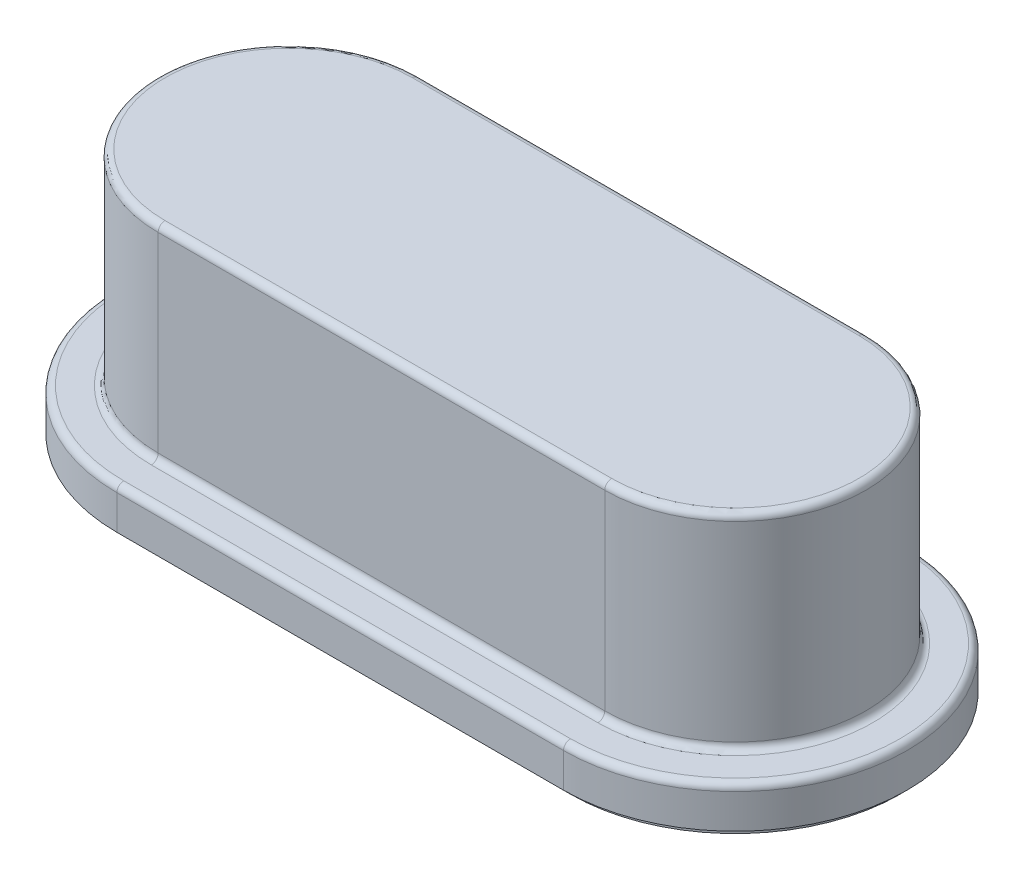
ISO-10303-21;
HEADER;
FILE_DESCRIPTION(('STEP AP214'),'2;1');
FILE_NAME('part.step','',(''),(''),'','','');
FILE_SCHEMA(('AUTOMOTIVE_DESIGN { 1 0 10303 214 1 1 1 1 }'));
ENDSEC;
DATA;
#1=APPLICATION_CONTEXT('core data for automotive mechanical design processes');
#2=APPLICATION_PROTOCOL_DEFINITION('international standard','automotive_design',2000,#1);
#3=PRODUCT_CONTEXT('',#1,'mechanical');
#4=PRODUCT('Part','Part','',(#3));
#5=PRODUCT_RELATED_PRODUCT_CATEGORY('part','',(#4));
#6=PRODUCT_DEFINITION_FORMATION('','',#4);
#7=PRODUCT_DEFINITION_CONTEXT('part definition',#1,'design');
#8=PRODUCT_DEFINITION('design','',#6,#7);
#9=PRODUCT_DEFINITION_SHAPE('','',#8);
#10=(LENGTH_UNIT() NAMED_UNIT(*) SI_UNIT(.MILLI.,.METRE.));
#11=(NAMED_UNIT(*) PLANE_ANGLE_UNIT() SI_UNIT($,.RADIAN.));
#12=(NAMED_UNIT(*) SI_UNIT($,.STERADIAN.) SOLID_ANGLE_UNIT());
#13=UNCERTAINTY_MEASURE_WITH_UNIT(LENGTH_MEASURE(1.E-05),#10,'distance_accuracy_value','');
#14=(GEOMETRIC_REPRESENTATION_CONTEXT(3) GLOBAL_UNCERTAINTY_ASSIGNED_CONTEXT((#13)) GLOBAL_UNIT_ASSIGNED_CONTEXT((#10,
#11,#12)) REPRESENTATION_CONTEXT('',''));
#15=CARTESIAN_POINT('',(0.,0.,0.));
#16=DIRECTION('',(0.,0.,1.));
#17=DIRECTION('',(1.,0.,0.));
#18=AXIS2_PLACEMENT_3D('',#15,#16,#17);
#19=CARTESIAN_POINT('',(-1.625,5.92,-1.425));
#20=DIRECTION('',(0.,-1.,0.));
#21=DIRECTION('',(0.,0.,-1.));
#22=AXIS2_PLACEMENT_3D('',#19,#20,#21);
#23=TOROIDAL_SURFACE('',#22,0.5,0.025);
#24=CARTESIAN_POINT('',(-1.625,5.92,-0.925));
#25=DIRECTION('',(-1.,0.,0.));
#26=DIRECTION('',(0.,0.,1.));
#27=AXIS2_PLACEMENT_3D('',#24,#25,#26);
#28=CIRCLE('',#27,0.025);
#29=CARTESIAN_POINT('',(-1.625,5.92,-0.95));
#30=VERTEX_POINT('',#29);
#31=CARTESIAN_POINT('',(-1.625,5.895,-0.925));
#32=VERTEX_POINT('',#31);
#33=EDGE_CURVE('E25',#30,#32,#28,.T.);
#34=ORIENTED_EDGE('',*,*,#33,.T.);
#35=CARTESIAN_POINT('',(-1.625,5.895,-1.425));
#36=DIRECTION('',(0.,-1.,0.));
#37=DIRECTION('',(0.,0.,-1.));
#38=AXIS2_PLACEMENT_3D('',#35,#36,#37);
#39=CIRCLE('',#38,0.5);
#40=CARTESIAN_POINT('',(-1.625,5.895,-1.925));
#41=VERTEX_POINT('',#40);
#42=EDGE_CURVE('E276',#41,#32,#39,.T.);
#43=ORIENTED_EDGE('',*,*,#42,.F.);
#44=CARTESIAN_POINT('',(-1.625,5.92,-1.925));
#45=DIRECTION('',(-1.,0.,0.));
#46=DIRECTION('',(0.,0.,1.));
#47=AXIS2_PLACEMENT_3D('',#44,#45,#46);
#48=CIRCLE('',#47,0.025);
#49=CARTESIAN_POINT('',(-1.625,5.92,-1.9));
#50=VERTEX_POINT('',#49);
#51=EDGE_CURVE('E11',#41,#50,#48,.T.);
#52=ORIENTED_EDGE('',*,*,#51,.T.);
#53=CARTESIAN_POINT('',(-1.625,5.92,-1.425));
#54=DIRECTION('',(0.,1.,0.));
#55=DIRECTION('',(0.,0.,-1.));
#56=AXIS2_PLACEMENT_3D('',#53,#54,#55);
#57=CIRCLE('',#56,0.475);
#58=EDGE_CURVE('E258',#30,#50,#57,.T.);
#59=ORIENTED_EDGE('',*,*,#58,.F.);
#60=EDGE_LOOP('',(#34,#43,#52,#59));
#61=FACE_BOUND('',#60,.T.);
#62=ADVANCED_FACE('F17',(#61),#23,.F.);
#63=CARTESIAN_POINT('',(-1.625,5.92,-1.925));
#64=DIRECTION('',(-1.,0.,0.));
#65=DIRECTION('',(0.,0.,1.));
#66=AXIS2_PLACEMENT_3D('',#63,#64,#65);
#67=CYLINDRICAL_SURFACE('',#66,0.025);
#68=CARTESIAN_POINT('',(-3.25,5.92,-1.925));
#69=DIRECTION('',(-1.,0.,0.));
#70=DIRECTION('',(0.,0.,1.));
#71=AXIS2_PLACEMENT_3D('',#68,#69,#70);
#72=CIRCLE('',#71,0.025);
#73=CARTESIAN_POINT('',(-3.25,5.895,-1.925));
#74=VERTEX_POINT('',#73);
#75=CARTESIAN_POINT('',(-3.25,5.92,-1.9));
#76=VERTEX_POINT('',#75);
#77=EDGE_CURVE('E236',#74,#76,#72,.T.);
#78=ORIENTED_EDGE('',*,*,#77,.T.);
#79=DIRECTION('',(-1.,0.,0.));
#80=VECTOR('',#79,1.);
#81=CARTESIAN_POINT('',(-1.625,5.92,-1.9));
#82=LINE('',#81,#80);
#83=EDGE_CURVE('E299',#50,#76,#82,.T.);
#84=ORIENTED_EDGE('',*,*,#83,.F.);
#85=ORIENTED_EDGE('',*,*,#51,.F.);
#86=DIRECTION('',(1.,0.,0.));
#87=VECTOR('',#86,1.);
#88=CARTESIAN_POINT('',(-3.25,5.895,-1.925));
#89=LINE('',#88,#87);
#90=EDGE_CURVE('E321',#74,#41,#89,.T.);
#91=ORIENTED_EDGE('',*,*,#90,.F.);
#92=EDGE_LOOP('',(#78,#84,#85,#91));
#93=FACE_BOUND('',#92,.T.);
#94=ADVANCED_FACE('F416',(#93),#67,.F.);
#95=CARTESIAN_POINT('',(-1.625,5.92,-0.925));
#96=DIRECTION('',(1.,0.,0.));
#97=DIRECTION('',(0.,0.,-1.));
#98=AXIS2_PLACEMENT_3D('',#95,#96,#97);
#99=CYLINDRICAL_SURFACE('',#98,0.025);
#100=CARTESIAN_POINT('',(-3.25,5.92,-0.925));
#101=DIRECTION('',(-1.,0.,0.));
#102=DIRECTION('',(0.,0.,1.));
#103=AXIS2_PLACEMENT_3D('',#100,#101,#102);
#104=CIRCLE('',#103,0.025);
#105=CARTESIAN_POINT('',(-3.25,5.92,-0.95));
#106=VERTEX_POINT('',#105);
#107=CARTESIAN_POINT('',(-3.25,5.895,-0.925));
#108=VERTEX_POINT('',#107);
#109=EDGE_CURVE('E238',#106,#108,#104,.T.);
#110=ORIENTED_EDGE('',*,*,#109,.T.);
#111=DIRECTION('',(-1.,0.,0.));
#112=VECTOR('',#111,1.);
#113=CARTESIAN_POINT('',(-3.25,5.895,-0.925));
#114=LINE('',#113,#112);
#115=EDGE_CURVE('E271',#32,#108,#114,.T.);
#116=ORIENTED_EDGE('',*,*,#115,.F.);
#117=ORIENTED_EDGE('',*,*,#33,.F.);
#118=DIRECTION('',(1.,0.,0.));
#119=VECTOR('',#118,1.);
#120=CARTESIAN_POINT('',(-1.625,5.92,-0.95));
#121=LINE('',#120,#119);
#122=EDGE_CURVE('E270',#106,#30,#121,.T.);
#123=ORIENTED_EDGE('',*,*,#122,.F.);
#124=EDGE_LOOP('',(#110,#116,#117,#123));
#125=FACE_BOUND('',#124,.T.);
#126=ADVANCED_FACE('F409',(#125),#99,.F.);
#127=CARTESIAN_POINT('',(-3.25,5.92,-1.425));
#128=DIRECTION('',(0.,-1.,0.));
#129=DIRECTION('',(0.,0.,-1.));
#130=AXIS2_PLACEMENT_3D('',#127,#128,#129);
#131=TOROIDAL_SURFACE('',#130,0.5,0.025);
#132=ORIENTED_EDGE('',*,*,#77,.F.);
#133=CARTESIAN_POINT('',(-3.25,5.895,-1.425));
#134=DIRECTION('',(0.,-1.,0.));
#135=DIRECTION('',(0.,0.,-1.));
#136=AXIS2_PLACEMENT_3D('',#133,#134,#135);
#137=CIRCLE('',#136,0.5);
#138=EDGE_CURVE('E275',#108,#74,#137,.T.);
#139=ORIENTED_EDGE('',*,*,#138,.F.);
#140=ORIENTED_EDGE('',*,*,#109,.F.);
#141=CARTESIAN_POINT('',(-3.25,5.92,-1.425));
#142=DIRECTION('',(0.,1.,0.));
#143=DIRECTION('',(0.,0.,-1.));
#144=AXIS2_PLACEMENT_3D('',#141,#142,#143);
#145=CIRCLE('',#144,0.475);
#146=EDGE_CURVE('E285',#76,#106,#145,.T.);
#147=ORIENTED_EDGE('',*,*,#146,.F.);
#148=EDGE_LOOP('',(#132,#139,#140,#147));
#149=FACE_BOUND('',#148,.T.);
#150=ADVANCED_FACE('F530',(#149),#131,.F.);
#151=CARTESIAN_POINT('',(-1.625,6.615,-1.425));
#152=DIRECTION('',(0.,1.,0.));
#153=DIRECTION('',(0.,0.,1.));
#154=AXIS2_PLACEMENT_3D('',#151,#152,#153);
#155=TOROIDAL_SURFACE('',#154,0.45,0.025);
#156=CARTESIAN_POINT('',(-1.625,6.615,-0.975));
#157=DIRECTION('',(1.,0.,0.));
#158=DIRECTION('',(0.,0.,-1.));
#159=AXIS2_PLACEMENT_3D('',#156,#157,#158);
#160=CIRCLE('',#159,0.025);
#161=CARTESIAN_POINT('',(-1.625,6.64,-0.975));
#162=VERTEX_POINT('',#161);
#163=CARTESIAN_POINT('',(-1.625,6.615,-0.95));
#164=VERTEX_POINT('',#163);
#165=EDGE_CURVE('E231',#162,#164,#160,.T.);
#166=ORIENTED_EDGE('',*,*,#165,.T.);
#167=CARTESIAN_POINT('',(-1.625,6.615,-1.425));
#168=DIRECTION('',(0.,-1.,0.));
#169=DIRECTION('',(0.,0.,1.));
#170=AXIS2_PLACEMENT_3D('',#167,#168,#169);
#171=CIRCLE('',#170,0.475);
#172=CARTESIAN_POINT('',(-1.625,6.615,-1.9));
#173=VERTEX_POINT('',#172);
#174=EDGE_CURVE('E362',#173,#164,#171,.T.);
#175=ORIENTED_EDGE('',*,*,#174,.F.);
#176=CARTESIAN_POINT('',(-1.625,6.615,-1.875));
#177=DIRECTION('',(1.,0.,0.));
#178=DIRECTION('',(0.,0.,-1.));
#179=AXIS2_PLACEMENT_3D('',#176,#177,#178);
#180=CIRCLE('',#179,0.025);
#181=CARTESIAN_POINT('',(-1.625,6.64,-1.875));
#182=VERTEX_POINT('',#181);
#183=EDGE_CURVE('E234',#173,#182,#180,.T.);
#184=ORIENTED_EDGE('',*,*,#183,.T.);
#185=CARTESIAN_POINT('',(-1.625,6.64,-1.425));
#186=DIRECTION('',(0.,1.,0.));
#187=DIRECTION('',(0.,0.,1.));
#188=AXIS2_PLACEMENT_3D('',#185,#186,#187);
#189=CIRCLE('',#188,0.45);
#190=EDGE_CURVE('E298',#162,#182,#189,.T.);
#191=ORIENTED_EDGE('',*,*,#190,.F.);
#192=EDGE_LOOP('',(#166,#175,#184,#191));
#193=FACE_BOUND('',#192,.T.);
#194=ADVANCED_FACE('F393',(#193),#155,.T.);
#195=CARTESIAN_POINT('',(-1.625,6.615,-1.875));
#196=DIRECTION('',(-1.,0.,0.));
#197=DIRECTION('',(0.,0.,1.));
#198=AXIS2_PLACEMENT_3D('',#195,#196,#197);
#199=CYLINDRICAL_SURFACE('',#198,0.025);
#200=CARTESIAN_POINT('',(-3.25,6.615,-1.875));
#201=DIRECTION('',(1.,0.,0.));
#202=DIRECTION('',(0.,0.,-1.));
#203=AXIS2_PLACEMENT_3D('',#200,#201,#202);
#204=CIRCLE('',#203,0.025);
#205=CARTESIAN_POINT('',(-3.25,6.615,-1.9));
#206=VERTEX_POINT('',#205);
#207=CARTESIAN_POINT('',(-3.25,6.64,-1.875));
#208=VERTEX_POINT('',#207);
#209=EDGE_CURVE('E227',#206,#208,#204,.T.);
#210=ORIENTED_EDGE('',*,*,#209,.T.);
#211=DIRECTION('',(-1.,0.,0.));
#212=VECTOR('',#211,1.);
#213=CARTESIAN_POINT('',(-1.625,6.64,-1.875));
#214=LINE('',#213,#212);
#215=EDGE_CURVE('E303',#182,#208,#214,.T.);
#216=ORIENTED_EDGE('',*,*,#215,.F.);
#217=ORIENTED_EDGE('',*,*,#183,.F.);
#218=DIRECTION('',(1.,0.,0.));
#219=VECTOR('',#218,1.);
#220=CARTESIAN_POINT('',(-1.625,6.615,-1.9));
#221=LINE('',#220,#219);
#222=EDGE_CURVE('E289',#206,#173,#221,.T.);
#223=ORIENTED_EDGE('',*,*,#222,.F.);
#224=EDGE_LOOP('',(#210,#216,#217,#223));
#225=FACE_BOUND('',#224,.T.);
#226=ADVANCED_FACE('F537',(#225),#199,.T.);
#227=CARTESIAN_POINT('',(-1.625,6.615,-0.975));
#228=DIRECTION('',(1.,0.,0.));
#229=DIRECTION('',(0.,0.,-1.));
#230=AXIS2_PLACEMENT_3D('',#227,#228,#229);
#231=CYLINDRICAL_SURFACE('',#230,0.025);
#232=CARTESIAN_POINT('',(-3.25,6.615,-0.975));
#233=DIRECTION('',(1.,0.,0.));
#234=DIRECTION('',(0.,0.,-1.));
#235=AXIS2_PLACEMENT_3D('',#232,#233,#234);
#236=CIRCLE('',#235,0.025);
#237=CARTESIAN_POINT('',(-3.25,6.64,-0.975));
#238=VERTEX_POINT('',#237);
#239=CARTESIAN_POINT('',(-3.25,6.615,-0.95));
#240=VERTEX_POINT('',#239);
#241=EDGE_CURVE('E230',#238,#240,#236,.T.);
#242=ORIENTED_EDGE('',*,*,#241,.T.);
#243=DIRECTION('',(-1.,0.,0.));
#244=VECTOR('',#243,1.);
#245=CARTESIAN_POINT('',(-1.625,6.615,-0.95));
#246=LINE('',#245,#244);
#247=EDGE_CURVE('E262',#164,#240,#246,.T.);
#248=ORIENTED_EDGE('',*,*,#247,.F.);
#249=ORIENTED_EDGE('',*,*,#165,.F.);
#250=DIRECTION('',(1.,0.,0.));
#251=VECTOR('',#250,1.);
#252=CARTESIAN_POINT('',(-1.625,6.64,-0.975));
#253=LINE('',#252,#251);
#254=EDGE_CURVE('E294',#238,#162,#253,.T.);
#255=ORIENTED_EDGE('',*,*,#254,.F.);
#256=EDGE_LOOP('',(#242,#248,#249,#255));
#257=FACE_BOUND('',#256,.T.);
#258=ADVANCED_FACE('F398',(#257),#231,.T.);
#259=CARTESIAN_POINT('',(-3.25,6.615,-1.425));
#260=DIRECTION('',(0.,1.,0.));
#261=DIRECTION('',(0.,0.,1.));
#262=AXIS2_PLACEMENT_3D('',#259,#260,#261);
#263=TOROIDAL_SURFACE('',#262,0.45,0.025);
#264=ORIENTED_EDGE('',*,*,#209,.F.);
#265=CARTESIAN_POINT('',(-3.25,6.615,-1.425));
#266=DIRECTION('',(0.,-1.,0.));
#267=DIRECTION('',(0.,0.,1.));
#268=AXIS2_PLACEMENT_3D('',#265,#266,#267);
#269=CIRCLE('',#268,0.475);
#270=EDGE_CURVE('E280',#240,#206,#269,.T.);
#271=ORIENTED_EDGE('',*,*,#270,.F.);
#272=ORIENTED_EDGE('',*,*,#241,.F.);
#273=CARTESIAN_POINT('',(-3.25,6.64,-1.425));
#274=DIRECTION('',(0.,1.,0.));
#275=DIRECTION('',(0.,0.,1.));
#276=AXIS2_PLACEMENT_3D('',#273,#274,#275);
#277=CIRCLE('',#276,0.45);
#278=EDGE_CURVE('E309',#208,#238,#277,.T.);
#279=ORIENTED_EDGE('',*,*,#278,.F.);
#280=EDGE_LOOP('',(#264,#271,#272,#279));
#281=FACE_BOUND('',#280,.T.);
#282=ADVANCED_FACE('F405',(#281),#263,.T.);
#283=CARTESIAN_POINT('',(-1.625,5.87,-1.425));
#284=DIRECTION('',(0.,-1.,0.));
#285=DIRECTION('',(0.,0.,-1.));
#286=AXIS2_PLACEMENT_3D('',#283,#284,#285);
#287=TOROIDAL_SURFACE('',#286,0.6,0.025);
#288=CARTESIAN_POINT('',(-1.625,5.87,-2.025));
#289=DIRECTION('',(1.,0.,0.));
#290=DIRECTION('',(0.,0.,-1.));
#291=AXIS2_PLACEMENT_3D('',#288,#289,#290);
#292=CIRCLE('',#291,0.025);
#293=CARTESIAN_POINT('',(-1.625,5.87,-2.05));
#294=VERTEX_POINT('',#293);
#295=CARTESIAN_POINT('',(-1.625,5.895,-2.025));
#296=VERTEX_POINT('',#295);
#297=EDGE_CURVE('E223',#294,#296,#292,.T.);
#298=ORIENTED_EDGE('',*,*,#297,.T.);
#299=CARTESIAN_POINT('',(-1.625,5.895,-1.425));
#300=DIRECTION('',(0.,1.,0.));
#301=DIRECTION('',(0.,0.,-1.));
#302=AXIS2_PLACEMENT_3D('',#299,#300,#301);
#303=CIRCLE('',#302,0.6);
#304=CARTESIAN_POINT('',(-1.625,5.895,-0.825));
#305=VERTEX_POINT('',#304);
#306=EDGE_CURVE('E308',#305,#296,#303,.T.);
#307=ORIENTED_EDGE('',*,*,#306,.F.);
#308=CARTESIAN_POINT('',(-1.625,5.87,-0.825));
#309=DIRECTION('',(1.,0.,0.));
#310=DIRECTION('',(0.,0.,-1.));
#311=AXIS2_PLACEMENT_3D('',#308,#309,#310);
#312=CIRCLE('',#311,0.025);
#313=CARTESIAN_POINT('',(-1.625,5.87,-0.8));
#314=VERTEX_POINT('',#313);
#315=EDGE_CURVE('E224',#305,#314,#312,.T.);
#316=ORIENTED_EDGE('',*,*,#315,.T.);
#317=CARTESIAN_POINT('',(-1.625,5.87,-1.425));
#318=DIRECTION('',(0.,-1.,0.));
#319=DIRECTION('',(0.,0.,-1.));
#320=AXIS2_PLACEMENT_3D('',#317,#318,#319);
#321=CIRCLE('',#320,0.625);
#322=EDGE_CURVE('E438',#294,#314,#321,.T.);
#323=ORIENTED_EDGE('',*,*,#322,.F.);
#324=EDGE_LOOP('',(#298,#307,#316,#323));
#325=FACE_BOUND('',#324,.T.);
#326=ADVANCED_FACE('F490',(#325),#287,.T.);
#327=CARTESIAN_POINT('',(-3.25,5.87,-0.825));
#328=DIRECTION('',(-1.,0.,0.));
#329=DIRECTION('',(0.,0.,1.));
#330=AXIS2_PLACEMENT_3D('',#327,#328,#329);
#331=CYLINDRICAL_SURFACE('',#330,0.025);
#332=CARTESIAN_POINT('',(-3.25,5.87,-0.825));
#333=DIRECTION('',(1.,0.,0.));
#334=DIRECTION('',(0.,0.,-1.));
#335=AXIS2_PLACEMENT_3D('',#332,#333,#334);
#336=CIRCLE('',#335,0.025);
#337=CARTESIAN_POINT('',(-3.25,5.895,-0.825));
#338=VERTEX_POINT('',#337);
#339=CARTESIAN_POINT('',(-3.25,5.87,-0.8));
#340=VERTEX_POINT('',#339);
#341=EDGE_CURVE('E216',#338,#340,#336,.T.);
#342=ORIENTED_EDGE('',*,*,#341,.T.);
#343=DIRECTION('',(-1.,0.,0.));
#344=VECTOR('',#343,1.);
#345=CARTESIAN_POINT('',(-3.25,5.87,-0.8));
#346=LINE('',#345,#344);
#347=EDGE_CURVE('E352',#314,#340,#346,.T.);
#348=ORIENTED_EDGE('',*,*,#347,.F.);
#349=ORIENTED_EDGE('',*,*,#315,.F.);
#350=DIRECTION('',(1.,0.,0.));
#351=VECTOR('',#350,1.);
#352=CARTESIAN_POINT('',(-3.25,5.895,-0.825));
#353=LINE('',#352,#351);
#354=EDGE_CURVE('E304',#338,#305,#353,.T.);
#355=ORIENTED_EDGE('',*,*,#354,.F.);
#356=EDGE_LOOP('',(#342,#348,#349,#355));
#357=FACE_BOUND('',#356,.T.);
#358=ADVANCED_FACE('F497',(#357),#331,.T.);
#359=CARTESIAN_POINT('',(-3.25,5.87,-2.025));
#360=DIRECTION('',(1.,0.,0.));
#361=DIRECTION('',(0.,0.,-1.));
#362=AXIS2_PLACEMENT_3D('',#359,#360,#361);
#363=CYLINDRICAL_SURFACE('',#362,0.025);
#364=CARTESIAN_POINT('',(-3.25,5.87,-2.025));
#365=DIRECTION('',(1.,0.,0.));
#366=DIRECTION('',(0.,0.,-1.));
#367=AXIS2_PLACEMENT_3D('',#364,#365,#366);
#368=CIRCLE('',#367,0.025);
#369=CARTESIAN_POINT('',(-3.25,5.87,-2.05));
#370=VERTEX_POINT('',#369);
#371=CARTESIAN_POINT('',(-3.25,5.895,-2.025));
#372=VERTEX_POINT('',#371);
#373=EDGE_CURVE('E220',#370,#372,#368,.T.);
#374=ORIENTED_EDGE('',*,*,#373,.T.);
#375=DIRECTION('',(-1.,0.,0.));
#376=VECTOR('',#375,1.);
#377=CARTESIAN_POINT('',(-3.25,5.895,-2.025));
#378=LINE('',#377,#376);
#379=EDGE_CURVE('E312',#296,#372,#378,.T.);
#380=ORIENTED_EDGE('',*,*,#379,.F.);
#381=ORIENTED_EDGE('',*,*,#297,.F.);
#382=DIRECTION('',(1.,0.,0.));
#383=VECTOR('',#382,1.);
#384=CARTESIAN_POINT('',(-3.25,5.87,-2.05));
#385=LINE('',#384,#383);
#386=EDGE_CURVE('E424',#370,#294,#385,.T.);
#387=ORIENTED_EDGE('',*,*,#386,.F.);
#388=EDGE_LOOP('',(#374,#380,#381,#387));
#389=FACE_BOUND('',#388,.T.);
#390=ADVANCED_FACE('F493',(#389),#363,.T.);
#391=CARTESIAN_POINT('',(-3.25,5.87,-1.425));
#392=DIRECTION('',(0.,-1.,0.));
#393=DIRECTION('',(0.,0.,-1.));
#394=AXIS2_PLACEMENT_3D('',#391,#392,#393);
#395=TOROIDAL_SURFACE('',#394,0.6,0.025);
#396=ORIENTED_EDGE('',*,*,#341,.F.);
#397=CARTESIAN_POINT('',(-3.25,5.895,-1.425));
#398=DIRECTION('',(0.,1.,0.));
#399=DIRECTION('',(0.,0.,-1.));
#400=AXIS2_PLACEMENT_3D('',#397,#398,#399);
#401=CIRCLE('',#400,0.6);
#402=EDGE_CURVE('E317',#372,#338,#401,.T.);
#403=ORIENTED_EDGE('',*,*,#402,.F.);
#404=ORIENTED_EDGE('',*,*,#373,.F.);
#405=CARTESIAN_POINT('',(-3.25,5.87,-1.425));
#406=DIRECTION('',(0.,-1.,0.));
#407=DIRECTION('',(0.,0.,-1.));
#408=AXIS2_PLACEMENT_3D('',#405,#406,#407);
#409=CIRCLE('',#408,0.625);
#410=EDGE_CURVE('E481',#340,#370,#409,.T.);
#411=ORIENTED_EDGE('',*,*,#410,.F.);
#412=EDGE_LOOP('',(#396,#403,#404,#411));
#413=FACE_BOUND('',#412,.T.);
#414=ADVANCED_FACE('F503',(#413),#395,.T.);
#415=CARTESIAN_POINT('',(-3.0475,5.7325,-1.425));
#416=DIRECTION('',(0.,-1.,0.));
#417=DIRECTION('',(0.,0.,-1.));
#418=AXIS2_PLACEMENT_3D('',#415,#416,#417);
#419=PLANE('',#418);
#420=CARTESIAN_POINT('',(-3.0475,5.7325,-1.425));
#421=DIRECTION('',(0.,-1.,0.));
#422=DIRECTION('',(0.,0.,-1.));
#423=AXIS2_PLACEMENT_3D('',#420,#421,#422);
#424=CIRCLE('',#423,0.05375);
#425=CARTESIAN_POINT('',(-3.0475,5.7325,-1.47875));
#426=VERTEX_POINT('',#425);
#427=EDGE_CURVE('E626',#426,#426,#424,.T.);
#428=ORIENTED_EDGE('',*,*,#427,.F.);
#429=EDGE_LOOP('',(#428));
#430=FACE_BOUND('',#429,.T.);
#431=CARTESIAN_POINT('',(-3.0475,5.7325,-1.425));
#432=DIRECTION('',(0.,-1.,0.));
#433=DIRECTION('',(0.,0.,-1.));
#434=AXIS2_PLACEMENT_3D('',#431,#432,#433);
#435=CIRCLE('',#434,0.1875);
#436=CARTESIAN_POINT('',(-3.0475,5.7325,-1.6125));
#437=VERTEX_POINT('',#436);
#438=EDGE_CURVE('E457',#437,#437,#435,.T.);
#439=ORIENTED_EDGE('',*,*,#438,.T.);
#440=EDGE_LOOP('',(#439));
#441=FACE_BOUND('',#440,.T.);
#442=ADVANCED_FACE('F550',(#430,#441),#419,.T.);
#443=CARTESIAN_POINT('',(-1.8275,5.7325,-1.425));
#444=DIRECTION('',(0.,-1.,0.));
#445=DIRECTION('',(0.,0.,-1.));
#446=AXIS2_PLACEMENT_3D('',#443,#444,#445);
#447=PLANE('',#446);
#448=CARTESIAN_POINT('',(-1.8275,5.7325,-1.425));
#449=DIRECTION('',(0.,-1.,0.));
#450=DIRECTION('',(0.,0.,-1.));
#451=AXIS2_PLACEMENT_3D('',#448,#449,#450);
#452=CIRCLE('',#451,0.05375);
#453=CARTESIAN_POINT('',(-1.8275,5.7325,-1.47875));
#454=VERTEX_POINT('',#453);
#455=EDGE_CURVE('E631',#454,#454,#452,.T.);
#456=ORIENTED_EDGE('',*,*,#455,.F.);
#457=EDGE_LOOP('',(#456));
#458=FACE_BOUND('',#457,.T.);
#459=CARTESIAN_POINT('',(-1.8275,5.7325,-1.425));
#460=DIRECTION('',(0.,-1.,0.));
#461=DIRECTION('',(0.,0.,-1.));
#462=AXIS2_PLACEMENT_3D('',#459,#460,#461);
#463=CIRCLE('',#462,0.1875);
#464=CARTESIAN_POINT('',(-1.8275,5.7325,-1.6125));
#465=VERTEX_POINT('',#464);
#466=EDGE_CURVE('E463',#465,#465,#463,.T.);
#467=ORIENTED_EDGE('',*,*,#466,.T.);
#468=EDGE_LOOP('',(#467));
#469=FACE_BOUND('',#468,.T.);
#470=ADVANCED_FACE('F553',(#458,#469),#447,.T.);
#471=CARTESIAN_POINT('',(-1.625,5.72,-1.425));
#472=DIRECTION('',(0.,1.,0.));
#473=DIRECTION('',(1.,0.,0.));
#474=AXIS2_PLACEMENT_3D('',#471,#472,#473);
#475=PLANE('',#474);
#476=CARTESIAN_POINT('',(-1.8275,5.72,-1.425));
#477=DIRECTION('',(0.,-1.,0.));
#478=DIRECTION('',(0.,0.,-1.));
#479=AXIS2_PLACEMENT_3D('',#476,#477,#478);
#480=CIRCLE('',#479,0.1875);
#481=CARTESIAN_POINT('',(-1.8275,5.72,-1.6125));
#482=VERTEX_POINT('',#481);
#483=EDGE_CURVE('E469',#482,#482,#480,.T.);
#484=ORIENTED_EDGE('',*,*,#483,.F.);
#485=EDGE_LOOP('',(#484));
#486=FACE_BOUND('',#485,.T.);
#487=CARTESIAN_POINT('',(-3.0475,5.72,-1.425));
#488=DIRECTION('',(0.,-1.,0.));
#489=DIRECTION('',(0.,0.,-1.));
#490=AXIS2_PLACEMENT_3D('',#487,#488,#489);
#491=CIRCLE('',#490,0.1875);
#492=CARTESIAN_POINT('',(-3.0475,5.72,-1.6125));
#493=VERTEX_POINT('',#492);
#494=EDGE_CURVE('E459',#493,#493,#491,.T.);
#495=ORIENTED_EDGE('',*,*,#494,.F.);
#496=EDGE_LOOP('',(#495));
#497=FACE_BOUND('',#496,.T.);
#498=CARTESIAN_POINT('',(-1.625,5.72,-1.425));
#499=DIRECTION('',(0.,-1.,0.));
#500=DIRECTION('',(0.,0.,-1.));
#501=AXIS2_PLACEMENT_3D('',#498,#499,#500);
#502=CIRCLE('',#501,0.6);
#503=CARTESIAN_POINT('',(-1.625,5.72,-2.025));
#504=VERTEX_POINT('',#503);
#505=CARTESIAN_POINT('',(-1.625,5.72,-0.825));
#506=VERTEX_POINT('',#505);
#507=EDGE_CURVE('E182',#504,#506,#502,.T.);
#508=ORIENTED_EDGE('',*,*,#507,.T.);
#509=DIRECTION('',(-1.,0.,0.));
#510=VECTOR('',#509,1.);
#511=CARTESIAN_POINT('',(-1.625,5.72,-0.825));
#512=LINE('',#511,#510);
#513=CARTESIAN_POINT('',(-3.25,5.72,-0.825));
#514=VERTEX_POINT('',#513);
#515=EDGE_CURVE('E37',#506,#514,#512,.T.);
#516=ORIENTED_EDGE('',*,*,#515,.T.);
#517=CARTESIAN_POINT('',(-3.25,5.72,-1.425));
#518=DIRECTION('',(0.,-1.,0.));
#519=DIRECTION('',(0.,0.,-1.));
#520=AXIS2_PLACEMENT_3D('',#517,#518,#519);
#521=CIRCLE('',#520,0.6);
#522=CARTESIAN_POINT('',(-3.25,5.72,-2.025));
#523=VERTEX_POINT('',#522);
#524=EDGE_CURVE('E47',#514,#523,#521,.T.);
#525=ORIENTED_EDGE('',*,*,#524,.T.);
#526=DIRECTION('',(1.,0.,0.));
#527=VECTOR('',#526,1.);
#528=CARTESIAN_POINT('',(-3.25,5.72,-2.025));
#529=LINE('',#528,#527);
#530=EDGE_CURVE('E178',#523,#504,#529,.T.);
#531=ORIENTED_EDGE('',*,*,#530,.T.);
#532=EDGE_LOOP('',(#508,#516,#525,#531));
#533=FACE_BOUND('',#532,.T.);
#534=ADVANCED_FACE('F180',(#486,#497,#533),#475,.F.);
#535=CARTESIAN_POINT('',(-1.625,5.745,-0.825));
#536=DIRECTION('',(0.,0.,1.));
#537=DIRECTION('',(1.,0.,0.));
#538=AXIS2_PLACEMENT_3D('',#535,#536,#537);
#539=PLANE('',#538);
#540=ORIENTED_EDGE('',*,*,#515,.F.);
#541=DIRECTION('',(0.,-1.,0.));
#542=VECTOR('',#541,1.);
#543=CARTESIAN_POINT('',(-1.625,5.745,-0.825));
#544=LINE('',#543,#542);
#545=CARTESIAN_POINT('',(-1.625,5.745,-0.825));
#546=VERTEX_POINT('',#545);
#547=EDGE_CURVE('E186',#546,#506,#544,.T.);
#548=ORIENTED_EDGE('',*,*,#547,.F.);
#549=DIRECTION('',(-1.,0.,0.));
#550=VECTOR('',#549,1.);
#551=CARTESIAN_POINT('',(-1.625,5.745,-0.825));
#552=LINE('',#551,#550);
#553=CARTESIAN_POINT('',(-3.25,5.745,-0.825));
#554=VERTEX_POINT('',#553);
#555=EDGE_CURVE('E207',#546,#554,#552,.T.);
#556=ORIENTED_EDGE('',*,*,#555,.T.);
#557=DIRECTION('',(0.,-1.,0.));
#558=VECTOR('',#557,1.);
#559=CARTESIAN_POINT('',(-3.25,5.745,-0.825));
#560=LINE('',#559,#558);
#561=EDGE_CURVE('E213',#554,#514,#560,.T.);
#562=ORIENTED_EDGE('',*,*,#561,.T.);
#563=EDGE_LOOP('',(#540,#548,#556,#562));
#564=FACE_BOUND('',#563,.T.);
#565=ADVANCED_FACE('F343',(#564),#539,.T.);
#566=CARTESIAN_POINT('',(-3.25,5.745,-1.425));
#567=DIRECTION('',(0.,-1.,0.));
#568=DIRECTION('',(0.,0.,-1.));
#569=AXIS2_PLACEMENT_3D('',#566,#567,#568);
#570=CYLINDRICAL_SURFACE('',#569,0.6);
#571=ORIENTED_EDGE('',*,*,#524,.F.);
#572=ORIENTED_EDGE('',*,*,#561,.F.);
#573=CARTESIAN_POINT('',(-3.25,5.745,-1.425));
#574=DIRECTION('',(0.,-1.,0.));
#575=DIRECTION('',(0.,0.,-1.));
#576=AXIS2_PLACEMENT_3D('',#573,#574,#575);
#577=CIRCLE('',#576,0.6);
#578=CARTESIAN_POINT('',(-3.25,5.745,-2.025));
#579=VERTEX_POINT('',#578);
#580=EDGE_CURVE('E293',#554,#579,#577,.T.);
#581=ORIENTED_EDGE('',*,*,#580,.T.);
#582=DIRECTION('',(0.,-1.,0.));
#583=VECTOR('',#582,1.);
#584=CARTESIAN_POINT('',(-3.25,5.745,-2.025));
#585=LINE('',#584,#583);
#586=EDGE_CURVE('E185',#579,#523,#585,.T.);
#587=ORIENTED_EDGE('',*,*,#586,.T.);
#588=EDGE_LOOP('',(#571,#572,#581,#587));
#589=FACE_BOUND('',#588,.T.);
#590=ADVANCED_FACE('F337',(#589),#570,.T.);
#591=CARTESIAN_POINT('',(-3.25,5.745,-2.025));
#592=DIRECTION('',(0.,0.,-1.));
#593=DIRECTION('',(0.,-1.,0.));
#594=AXIS2_PLACEMENT_3D('',#591,#592,#593);
#595=PLANE('',#594);
#596=ORIENTED_EDGE('',*,*,#530,.F.);
#597=ORIENTED_EDGE('',*,*,#586,.F.);
#598=DIRECTION('',(1.,0.,0.));
#599=VECTOR('',#598,1.);
#600=CARTESIAN_POINT('',(-3.25,5.745,-2.025));
#601=LINE('',#600,#599);
#602=CARTESIAN_POINT('',(-1.625,5.745,-2.025));
#603=VERTEX_POINT('',#602);
#604=EDGE_CURVE('E192',#579,#603,#601,.T.);
#605=ORIENTED_EDGE('',*,*,#604,.T.);
#606=DIRECTION('',(0.,-1.,0.));
#607=VECTOR('',#606,1.);
#608=CARTESIAN_POINT('',(-1.625,5.745,-2.025));
#609=LINE('',#608,#607);
#610=EDGE_CURVE('E189',#603,#504,#609,.T.);
#611=ORIENTED_EDGE('',*,*,#610,.T.);
#612=EDGE_LOOP('',(#596,#597,#605,#611));
#613=FACE_BOUND('',#612,.T.);
#614=ADVANCED_FACE('F190',(#613),#595,.T.);
#615=CARTESIAN_POINT('',(-1.625,5.745,-1.425));
#616=DIRECTION('',(0.,-1.,0.));
#617=DIRECTION('',(0.,0.,-1.));
#618=AXIS2_PLACEMENT_3D('',#615,#616,#617);
#619=CYLINDRICAL_SURFACE('',#618,0.6);
#620=ORIENTED_EDGE('',*,*,#507,.F.);
#621=ORIENTED_EDGE('',*,*,#610,.F.);
#622=CARTESIAN_POINT('',(-1.625,5.745,-1.425));
#623=DIRECTION('',(0.,-1.,0.));
#624=DIRECTION('',(0.,0.,-1.));
#625=AXIS2_PLACEMENT_3D('',#622,#623,#624);
#626=CIRCLE('',#625,0.6);
#627=EDGE_CURVE('E201',#603,#546,#626,.T.);
#628=ORIENTED_EDGE('',*,*,#627,.T.);
#629=ORIENTED_EDGE('',*,*,#547,.T.);
#630=EDGE_LOOP('',(#620,#621,#628,#629));
#631=FACE_BOUND('',#630,.T.);
#632=ADVANCED_FACE('F199',(#631),#619,.T.);
#633=CARTESIAN_POINT('',(-1.625,5.745,-1.425));
#634=DIRECTION('',(0.,-1.,0.));
#635=DIRECTION('',(0.,0.,-1.));
#636=AXIS2_PLACEMENT_3D('',#633,#634,#635);
#637=PLANE('',#636);
#638=ORIENTED_EDGE('',*,*,#604,.F.);
#639=ORIENTED_EDGE('',*,*,#580,.F.);
#640=ORIENTED_EDGE('',*,*,#555,.F.);
#641=ORIENTED_EDGE('',*,*,#627,.F.);
#642=EDGE_LOOP('',(#638,#639,#640,#641));
#643=FACE_BOUND('',#642,.T.);
#644=CARTESIAN_POINT('',(-1.625,5.745,-1.425));
#645=DIRECTION('',(0.,-1.,0.));
#646=DIRECTION('',(0.,0.,-1.));
#647=AXIS2_PLACEMENT_3D('',#644,#645,#646);
#648=CIRCLE('',#647,0.625);
#649=CARTESIAN_POINT('',(-1.625,5.745,-2.05));
#650=VERTEX_POINT('',#649);
#651=CARTESIAN_POINT('',(-1.625,5.745,-0.8));
#652=VERTEX_POINT('',#651);
#653=EDGE_CURVE('E350',#650,#652,#648,.T.);
#654=ORIENTED_EDGE('',*,*,#653,.T.);
#655=DIRECTION('',(-1.,0.,0.));
#656=VECTOR('',#655,1.);
#657=CARTESIAN_POINT('',(-1.625,5.745,-0.8));
#658=LINE('',#657,#656);
#659=CARTESIAN_POINT('',(-3.25,5.745,-0.8));
#660=VERTEX_POINT('',#659);
#661=EDGE_CURVE('E356',#652,#660,#658,.T.);
#662=ORIENTED_EDGE('',*,*,#661,.T.);
#663=CARTESIAN_POINT('',(-3.25,5.745,-1.425));
#664=DIRECTION('',(0.,-1.,0.));
#665=DIRECTION('',(0.,0.,-1.));
#666=AXIS2_PLACEMENT_3D('',#663,#664,#665);
#667=CIRCLE('',#666,0.625);
#668=CARTESIAN_POINT('',(-3.25,5.745,-2.05));
#669=VERTEX_POINT('',#668);
#670=EDGE_CURVE('E429',#660,#669,#667,.T.);
#671=ORIENTED_EDGE('',*,*,#670,.T.);
#672=DIRECTION('',(1.,0.,0.));
#673=VECTOR('',#672,1.);
#674=CARTESIAN_POINT('',(-3.25,5.745,-2.05));
#675=LINE('',#674,#673);
#676=EDGE_CURVE('E435',#669,#650,#675,.T.);
#677=ORIENTED_EDGE('',*,*,#676,.T.);
#678=EDGE_LOOP('',(#654,#662,#671,#677));
#679=FACE_BOUND('',#678,.T.);
#680=ADVANCED_FACE('F340',(#643,#679),#637,.T.);
#681=CARTESIAN_POINT('',(-3.25,5.895,-1.425));
#682=DIRECTION('',(0.,-1.,0.));
#683=DIRECTION('',(0.,0.,-1.));
#684=AXIS2_PLACEMENT_3D('',#681,#682,#683);
#685=PLANE('',#684);
#686=ORIENTED_EDGE('',*,*,#90,.T.);
#687=ORIENTED_EDGE('',*,*,#42,.T.);
#688=ORIENTED_EDGE('',*,*,#115,.T.);
#689=ORIENTED_EDGE('',*,*,#138,.T.);
#690=EDGE_LOOP('',(#686,#687,#688,#689));
#691=FACE_BOUND('',#690,.T.);
#692=ORIENTED_EDGE('',*,*,#354,.T.);
#693=ORIENTED_EDGE('',*,*,#306,.T.);
#694=ORIENTED_EDGE('',*,*,#379,.T.);
#695=ORIENTED_EDGE('',*,*,#402,.T.);
#696=EDGE_LOOP('',(#692,#693,#694,#695));
#697=FACE_BOUND('',#696,.T.);
#698=ADVANCED_FACE('F412',(#691,#697),#685,.F.);
#699=CARTESIAN_POINT('',(-1.625,6.64,-1.425));
#700=DIRECTION('',(0.,1.,0.));
#701=DIRECTION('',(1.,0.,0.));
#702=AXIS2_PLACEMENT_3D('',#699,#700,#701);
#703=PLANE('',#702);
#704=ORIENTED_EDGE('',*,*,#254,.T.);
#705=ORIENTED_EDGE('',*,*,#190,.T.);
#706=ORIENTED_EDGE('',*,*,#215,.T.);
#707=ORIENTED_EDGE('',*,*,#278,.T.);
#708=EDGE_LOOP('',(#704,#705,#706,#707));
#709=FACE_BOUND('',#708,.T.);
#710=ADVANCED_FACE('F574',(#709),#703,.T.);
#711=CARTESIAN_POINT('',(-1.625,5.72,-1.9));
#712=DIRECTION('',(0.,0.,-1.));
#713=DIRECTION('',(-1.,0.,0.));
#714=AXIS2_PLACEMENT_3D('',#711,#712,#713);
#715=PLANE('',#714);
#716=DIRECTION('',(0.,1.,0.));
#717=VECTOR('',#716,1.);
#718=CARTESIAN_POINT('',(-3.25,5.72,-1.9));
#719=LINE('',#718,#717);
#720=EDGE_CURVE('E284',#76,#206,#719,.T.);
#721=ORIENTED_EDGE('',*,*,#720,.T.);
#722=ORIENTED_EDGE('',*,*,#222,.T.);
#723=DIRECTION('',(0.,1.,0.));
#724=VECTOR('',#723,1.);
#725=CARTESIAN_POINT('',(-1.625,5.72,-1.9));
#726=LINE('',#725,#724);
#727=EDGE_CURVE('E359',#50,#173,#726,.T.);
#728=ORIENTED_EDGE('',*,*,#727,.F.);
#729=ORIENTED_EDGE('',*,*,#83,.T.);
#730=EDGE_LOOP('',(#721,#722,#728,#729));
#731=FACE_BOUND('',#730,.T.);
#732=ADVANCED_FACE('F384',(#731),#715,.T.);
#733=CARTESIAN_POINT('',(-3.25,5.72,-1.425));
#734=DIRECTION('',(0.,1.,0.));
#735=DIRECTION('',(0.,0.,1.));
#736=AXIS2_PLACEMENT_3D('',#733,#734,#735);
#737=CYLINDRICAL_SURFACE('',#736,0.475);
#738=DIRECTION('',(0.,1.,0.));
#739=VECTOR('',#738,1.);
#740=CARTESIAN_POINT('',(-3.25,5.72,-0.95));
#741=LINE('',#740,#739);
#742=EDGE_CURVE('E266',#106,#240,#741,.T.);
#743=ORIENTED_EDGE('',*,*,#742,.T.);
#744=ORIENTED_EDGE('',*,*,#270,.T.);
#745=ORIENTED_EDGE('',*,*,#720,.F.);
#746=ORIENTED_EDGE('',*,*,#146,.T.);
#747=EDGE_LOOP('',(#743,#744,#745,#746));
#748=FACE_BOUND('',#747,.T.);
#749=ADVANCED_FACE('F407',(#748),#737,.T.);
#750=CARTESIAN_POINT('',(-1.625,5.72,-0.95));
#751=DIRECTION('',(0.,0.,1.));
#752=DIRECTION('',(1.,0.,0.));
#753=AXIS2_PLACEMENT_3D('',#750,#751,#752);
#754=PLANE('',#753);
#755=DIRECTION('',(0.,1.,0.));
#756=VECTOR('',#755,1.);
#757=CARTESIAN_POINT('',(-1.625,5.72,-0.95));
#758=LINE('',#757,#756);
#759=EDGE_CURVE('E256',#30,#164,#758,.T.);
#760=ORIENTED_EDGE('',*,*,#759,.T.);
#761=ORIENTED_EDGE('',*,*,#247,.T.);
#762=ORIENTED_EDGE('',*,*,#742,.F.);
#763=ORIENTED_EDGE('',*,*,#122,.T.);
#764=EDGE_LOOP('',(#760,#761,#762,#763));
#765=FACE_BOUND('',#764,.T.);
#766=ADVANCED_FACE('F375',(#765),#754,.T.);
#767=CARTESIAN_POINT('',(-1.625,5.72,-1.425));
#768=DIRECTION('',(0.,1.,0.));
#769=DIRECTION('',(0.,0.,1.));
#770=AXIS2_PLACEMENT_3D('',#767,#768,#769);
#771=CYLINDRICAL_SURFACE('',#770,0.475);
#772=ORIENTED_EDGE('',*,*,#727,.T.);
#773=ORIENTED_EDGE('',*,*,#174,.T.);
#774=ORIENTED_EDGE('',*,*,#759,.F.);
#775=ORIENTED_EDGE('',*,*,#58,.T.);
#776=EDGE_LOOP('',(#772,#773,#774,#775));
#777=FACE_BOUND('',#776,.T.);
#778=ADVANCED_FACE('F378',(#777),#771,.T.);
#779=CARTESIAN_POINT('',(-3.25,5.72,-0.8));
#780=DIRECTION('',(0.,0.,-1.));
#781=DIRECTION('',(0.,-1.,0.));
#782=AXIS2_PLACEMENT_3D('',#779,#780,#781);
#783=PLANE('',#782);
#784=DIRECTION('',(0.,1.,0.));
#785=VECTOR('',#784,1.);
#786=CARTESIAN_POINT('',(-1.625,5.72,-0.8));
#787=LINE('',#786,#785);
#788=EDGE_CURVE('E441',#652,#314,#787,.T.);
#789=ORIENTED_EDGE('',*,*,#788,.T.);
#790=ORIENTED_EDGE('',*,*,#347,.T.);
#791=DIRECTION('',(0.,1.,0.));
#792=VECTOR('',#791,1.);
#793=CARTESIAN_POINT('',(-3.25,5.72,-0.8));
#794=LINE('',#793,#792);
#795=EDGE_CURVE('E477',#660,#340,#794,.T.);
#796=ORIENTED_EDGE('',*,*,#795,.F.);
#797=ORIENTED_EDGE('',*,*,#661,.F.);
#798=EDGE_LOOP('',(#789,#790,#796,#797));
#799=FACE_BOUND('',#798,.T.);
#800=ADVANCED_FACE('F501',(#799),#783,.F.);
#801=CARTESIAN_POINT('',(-1.625,5.72,-1.425));
#802=DIRECTION('',(0.,1.,0.));
#803=DIRECTION('',(0.,0.,1.));
#804=AXIS2_PLACEMENT_3D('',#801,#802,#803);
#805=CYLINDRICAL_SURFACE('',#804,0.625);
#806=DIRECTION('',(0.,1.,0.));
#807=VECTOR('',#806,1.);
#808=CARTESIAN_POINT('',(-1.625,5.72,-2.05));
#809=LINE('',#808,#807);
#810=EDGE_CURVE('E428',#650,#294,#809,.T.);
#811=ORIENTED_EDGE('',*,*,#810,.T.);
#812=ORIENTED_EDGE('',*,*,#322,.T.);
#813=ORIENTED_EDGE('',*,*,#788,.F.);
#814=ORIENTED_EDGE('',*,*,#653,.F.);
#815=EDGE_LOOP('',(#811,#812,#813,#814));
#816=FACE_BOUND('',#815,.T.);
#817=ADVANCED_FACE('F510',(#816),#805,.T.);
#818=CARTESIAN_POINT('',(-3.25,5.72,-2.05));
#819=DIRECTION('',(0.,0.,1.));
#820=DIRECTION('',(1.,0.,0.));
#821=AXIS2_PLACEMENT_3D('',#818,#819,#820);
#822=PLANE('',#821);
#823=DIRECTION('',(0.,1.,0.));
#824=VECTOR('',#823,1.);
#825=CARTESIAN_POINT('',(-3.25,5.72,-2.05));
#826=LINE('',#825,#824);
#827=EDGE_CURVE('E473',#669,#370,#826,.T.);
#828=ORIENTED_EDGE('',*,*,#827,.T.);
#829=ORIENTED_EDGE('',*,*,#386,.T.);
#830=ORIENTED_EDGE('',*,*,#810,.F.);
#831=ORIENTED_EDGE('',*,*,#676,.F.);
#832=EDGE_LOOP('',(#828,#829,#830,#831));
#833=FACE_BOUND('',#832,.T.);
#834=ADVANCED_FACE('F512',(#833),#822,.F.);
#835=CARTESIAN_POINT('',(-3.25,5.72,-1.425));
#836=DIRECTION('',(0.,1.,0.));
#837=DIRECTION('',(0.,0.,1.));
#838=AXIS2_PLACEMENT_3D('',#835,#836,#837);
#839=CYLINDRICAL_SURFACE('',#838,0.625);
#840=ORIENTED_EDGE('',*,*,#795,.T.);
#841=ORIENTED_EDGE('',*,*,#410,.T.);
#842=ORIENTED_EDGE('',*,*,#827,.F.);
#843=ORIENTED_EDGE('',*,*,#670,.F.);
#844=EDGE_LOOP('',(#840,#841,#842,#843));
#845=FACE_BOUND('',#844,.T.);
#846=ADVANCED_FACE('F507',(#845),#839,.T.);
#847=CARTESIAN_POINT('',(-1.8275,5.7325,-1.425));
#848=DIRECTION('',(0.,-1.,0.));
#849=DIRECTION('',(0.,0.,-1.));
#850=AXIS2_PLACEMENT_3D('',#847,#848,#849);
#851=CYLINDRICAL_SURFACE('',#850,0.1875);
#852=ORIENTED_EDGE('',*,*,#483,.T.);
#853=EDGE_LOOP('',(#852));
#854=FACE_BOUND('',#853,.T.);
#855=ORIENTED_EDGE('',*,*,#466,.F.);
#856=EDGE_LOOP('',(#855));
#857=FACE_BOUND('',#856,.T.);
#858=ADVANCED_FACE('F607',(#854,#857),#851,.F.);
#859=CARTESIAN_POINT('',(-3.0475,5.7325,-1.425));
#860=DIRECTION('',(0.,-1.,0.));
#861=DIRECTION('',(0.,0.,-1.));
#862=AXIS2_PLACEMENT_3D('',#859,#860,#861);
#863=CYLINDRICAL_SURFACE('',#862,0.1875);
#864=ORIENTED_EDGE('',*,*,#494,.T.);
#865=EDGE_LOOP('',(#864));
#866=FACE_BOUND('',#865,.T.);
#867=ORIENTED_EDGE('',*,*,#438,.F.);
#868=EDGE_LOOP('',(#867));
#869=FACE_BOUND('',#868,.T.);
#870=ADVANCED_FACE('F603',(#866,#869),#863,.F.);
#871=CARTESIAN_POINT('',(-3.0475,2.4325,-1.425));
#872=DIRECTION('',(0.,1.,0.));
#873=DIRECTION('',(0.,0.,1.));
#874=AXIS2_PLACEMENT_3D('',#871,#872,#873);
#875=CYLINDRICAL_SURFACE('',#874,0.05375);
#876=CARTESIAN_POINT('',(-3.0475,5.72,-1.425));
#877=DIRECTION('',(0.,1.,0.));
#878=DIRECTION('',(0.,0.,1.));
#879=AXIS2_PLACEMENT_3D('',#876,#877,#878);
#880=CIRCLE('',#879,0.05375);
#881=CARTESIAN_POINT('',(-3.0475,5.72,-1.37125));
#882=VERTEX_POINT('',#881);
#883=EDGE_CURVE('E794',#882,#882,#880,.T.);
#884=ORIENTED_EDGE('',*,*,#883,.T.);
#885=EDGE_LOOP('',(#884));
#886=FACE_BOUND('',#885,.T.);
#887=ORIENTED_EDGE('',*,*,#427,.T.);
#888=EDGE_LOOP('',(#887));
#889=FACE_BOUND('',#888,.T.);
#890=ADVANCED_FACE('F599',(#886,#889),#875,.T.);
#891=CARTESIAN_POINT('',(-1.8275,2.4325,-1.425));
#892=DIRECTION('',(0.,1.,0.));
#893=DIRECTION('',(0.,0.,1.));
#894=AXIS2_PLACEMENT_3D('',#891,#892,#893);
#895=CYLINDRICAL_SURFACE('',#894,0.05375);
#896=CARTESIAN_POINT('',(-1.8275,5.72,-1.425));
#897=DIRECTION('',(0.,1.,0.));
#898=DIRECTION('',(0.,0.,1.));
#899=AXIS2_PLACEMENT_3D('',#896,#897,#898);
#900=CIRCLE('',#899,0.05375);
#901=CARTESIAN_POINT('',(-1.8275,5.72,-1.37125));
#902=VERTEX_POINT('',#901);
#903=EDGE_CURVE('E639',#902,#902,#900,.T.);
#904=ORIENTED_EDGE('',*,*,#903,.T.);
#905=EDGE_LOOP('',(#904));
#906=FACE_BOUND('',#905,.T.);
#907=ORIENTED_EDGE('',*,*,#455,.T.);
#908=EDGE_LOOP('',(#907));
#909=FACE_BOUND('',#908,.T.);
#910=ADVANCED_FACE('F593',(#906,#909),#895,.T.);
#911=CARTESIAN_POINT('',(-2.4375,5.72,-1.425));
#912=DIRECTION('',(0.,-1.,0.));
#913=DIRECTION('',(0.,0.,-1.));
#914=AXIS2_PLACEMENT_3D('',#911,#912,#913);
#915=PLANE('',#914);
#916=ORIENTED_EDGE('',*,*,#903,.F.);
#917=EDGE_LOOP('',(#916));
#918=FACE_BOUND('',#917,.T.);
#919=ADVANCED_FACE('F590',(#918),#915,.T.);
#920=CARTESIAN_POINT('',(-2.4375,5.72,-1.425));
#921=DIRECTION('',(0.,-1.,0.));
#922=DIRECTION('',(0.,0.,-1.));
#923=AXIS2_PLACEMENT_3D('',#920,#921,#922);
#924=PLANE('',#923);
#925=ORIENTED_EDGE('',*,*,#883,.F.);
#926=EDGE_LOOP('',(#925));
#927=FACE_BOUND('',#926,.T.);
#928=ADVANCED_FACE('F588',(#927),#924,.T.);
#929=CLOSED_SHELL('',(#62,#94,#126,#150,#194,#226,#258,#282,#326,#358,#390,#414,#442,#470,#534,
#565,#590,#614,#632,#680,#698,#710,#732,#749,#766,#778,#800,#817,#834,#846,#858,#870,#890,#910,
#919,#928));
#930=MANIFOLD_SOLID_BREP('B1',#929);
#931=ADVANCED_BREP_SHAPE_REPRESENTATION('',(#18,#930),#14);
#932=SHAPE_DEFINITION_REPRESENTATION(#9,#931);
ENDSEC;
END-ISO-10303-21;
